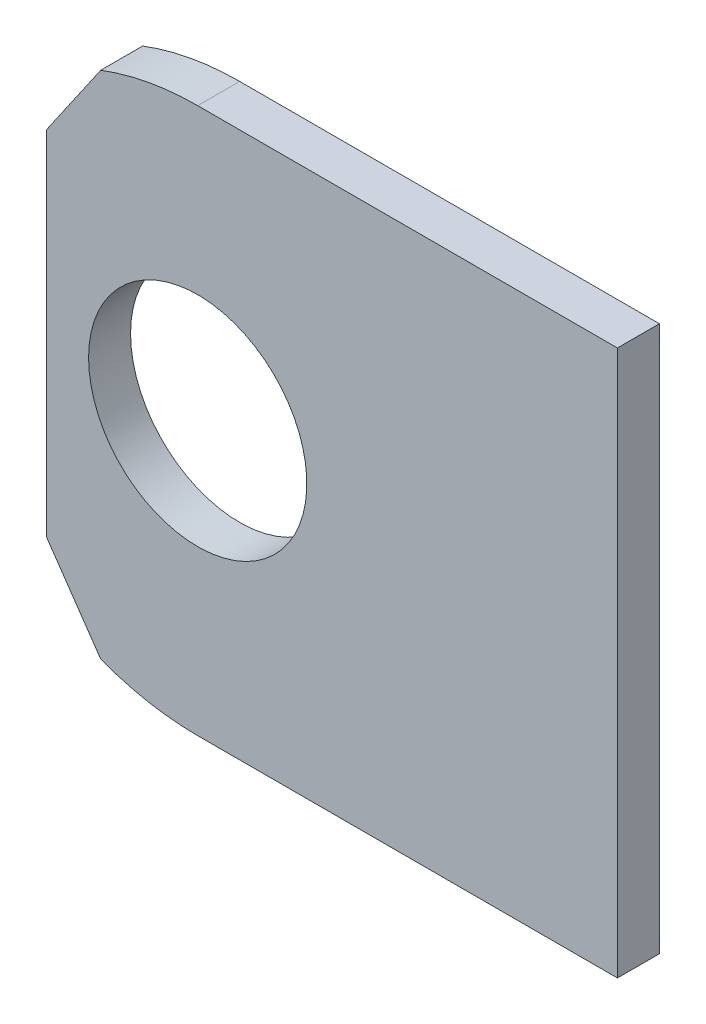
ISO-10303-21;
HEADER;
FILE_DESCRIPTION(('STEP AP214'),'2;1');
FILE_NAME('part.step','',(''),(''),'','','');
FILE_SCHEMA(('AUTOMOTIVE_DESIGN { 1 0 10303 214 1 1 1 1 }'));
ENDSEC;
DATA;
#1=APPLICATION_CONTEXT('core data for automotive mechanical design processes');
#2=APPLICATION_PROTOCOL_DEFINITION('international standard','automotive_design',2000,#1);
#3=PRODUCT_CONTEXT('',#1,'mechanical');
#4=PRODUCT('Part','Part','',(#3));
#5=PRODUCT_RELATED_PRODUCT_CATEGORY('part','',(#4));
#6=PRODUCT_DEFINITION_FORMATION('','',#4);
#7=PRODUCT_DEFINITION_CONTEXT('part definition',#1,'design');
#8=PRODUCT_DEFINITION('design','',#6,#7);
#9=PRODUCT_DEFINITION_SHAPE('','',#8);
#10=(LENGTH_UNIT() NAMED_UNIT(*) SI_UNIT(.MILLI.,.METRE.));
#11=(NAMED_UNIT(*) PLANE_ANGLE_UNIT() SI_UNIT($,.RADIAN.));
#12=(NAMED_UNIT(*) SI_UNIT($,.STERADIAN.) SOLID_ANGLE_UNIT());
#13=UNCERTAINTY_MEASURE_WITH_UNIT(LENGTH_MEASURE(1.E-05),#10,'distance_accuracy_value','');
#14=(GEOMETRIC_REPRESENTATION_CONTEXT(3) GLOBAL_UNCERTAINTY_ASSIGNED_CONTEXT((#13)) GLOBAL_UNIT_ASSIGNED_CONTEXT((#10,
#11,#12)) REPRESENTATION_CONTEXT('',''));
#15=CARTESIAN_POINT('',(0.,0.,0.));
#16=DIRECTION('',(0.,0.,1.));
#17=DIRECTION('',(1.,0.,0.));
#18=AXIS2_PLACEMENT_3D('',#15,#16,#17);
#19=CARTESIAN_POINT('',(0.,0.,0.));
#20=DIRECTION('',(0.,0.,1.));
#21=DIRECTION('',(1.,0.,0.));
#22=AXIS2_PLACEMENT_3D('',#19,#20,#21);
#23=PLANE('',#22);
#24=CARTESIAN_POINT('',(0.,0.,0.));
#25=DIRECTION('',(0.,0.,-1.));
#26=DIRECTION('',(-1.,0.,0.));
#27=AXIS2_PLACEMENT_3D('',#24,#25,#26);
#28=CIRCLE('',#27,2.6);
#29=CARTESIAN_POINT('',(-2.6,0.,0.));
#30=VERTEX_POINT('',#29);
#31=EDGE_CURVE('E96',#30,#30,#28,.F.);
#32=ORIENTED_EDGE('',*,*,#31,.T.);
#33=EDGE_LOOP('',(#32));
#34=FACE_BOUND('',#33,.T.);
#35=DIRECTION('',(1.,0.,0.));
#36=VECTOR('',#35,1.);
#37=CARTESIAN_POINT('',(0.,6.5,0.));
#38=LINE('',#37,#36);
#39=CARTESIAN_POINT('',(10.,6.5,0.));
#40=VERTEX_POINT('',#39);
#41=CARTESIAN_POINT('',(0.,6.5,0.));
#42=VERTEX_POINT('',#41);
#43=EDGE_CURVE('E83',#40,#42,#38,.F.);
#44=ORIENTED_EDGE('',*,*,#43,.F.);
#45=DIRECTION('',(0.,1.,0.));
#46=VECTOR('',#45,1.);
#47=CARTESIAN_POINT('',(10.,6.5,0.));
#48=LINE('',#47,#46);
#49=CARTESIAN_POINT('',(10.,-6.5,0.));
#50=VERTEX_POINT('',#49);
#51=EDGE_CURVE('E100',#50,#40,#48,.T.);
#52=ORIENTED_EDGE('',*,*,#51,.F.);
#53=DIRECTION('',(1.,0.,0.));
#54=VECTOR('',#53,1.);
#55=CARTESIAN_POINT('',(10.,-6.5,0.));
#56=LINE('',#55,#54);
#57=CARTESIAN_POINT('',(0.,-6.5,0.));
#58=VERTEX_POINT('',#57);
#59=EDGE_CURVE('E111',#58,#50,#56,.T.);
#60=ORIENTED_EDGE('',*,*,#59,.F.);
#61=CARTESIAN_POINT('',(0.,0.,0.));
#62=DIRECTION('',(0.,0.,1.));
#63=DIRECTION('',(1.,0.,0.));
#64=AXIS2_PLACEMENT_3D('',#61,#62,#63);
#65=CIRCLE('',#64,6.5);
#66=CARTESIAN_POINT('',(-2.31111111111165,-6.07525846627913,0.));
#67=VERTEX_POINT('',#66);
#68=EDGE_CURVE('E120',#67,#58,#65,.T.);
#69=ORIENTED_EDGE('',*,*,#68,.F.);
#70=DIRECTION('',(0.567646212197499,-0.823272602348598,0.));
#71=VECTOR('',#70,1.);
#72=CARTESIAN_POINT('',(-2.955555555556,-5.140603317621,0.));
#73=LINE('',#72,#71);
#74=CARTESIAN_POINT('',(-3.60000000000005,-4.20594816896305,0.));
#75=VERTEX_POINT('',#74);
#76=EDGE_CURVE('E117',#75,#67,#73,.T.);
#77=ORIENTED_EDGE('',*,*,#76,.F.);
#78=DIRECTION('',(0.,1.,0.));
#79=VECTOR('',#78,1.);
#80=CARTESIAN_POINT('',(-3.6,-6.5,0.));
#81=LINE('',#80,#79);
#82=CARTESIAN_POINT('',(-3.60000000000003,4.20594816896304,0.));
#83=VERTEX_POINT('',#82);
#84=EDGE_CURVE('E124',#75,#83,#81,.T.);
#85=ORIENTED_EDGE('',*,*,#84,.T.);
#86=DIRECTION('',(-0.567646212197499,-0.823272602348598,0.));
#87=VECTOR('',#86,1.);
#88=CARTESIAN_POINT('',(-2.955555555556,5.140603317621,0.));
#89=LINE('',#88,#87);
#90=CARTESIAN_POINT('',(-2.31111111111174,6.07525846627921,0.));
#91=VERTEX_POINT('',#90);
#92=EDGE_CURVE('E85',#91,#83,#89,.T.);
#93=ORIENTED_EDGE('',*,*,#92,.F.);
#94=CARTESIAN_POINT('',(0.,0.,0.));
#95=DIRECTION('',(0.,0.,1.));
#96=DIRECTION('',(1.,0.,0.));
#97=AXIS2_PLACEMENT_3D('',#94,#95,#96);
#98=CIRCLE('',#97,6.5);
#99=EDGE_CURVE('E20',#42,#91,#98,.T.);
#100=ORIENTED_EDGE('',*,*,#99,.F.);
#101=EDGE_LOOP('',(#44,#52,#60,#69,#77,#85,#93,#100));
#102=FACE_BOUND('',#101,.T.);
#103=ADVANCED_FACE('F17',(#34,#102),#23,.F.);
#104=CARTESIAN_POINT('',(0.,0.,0.));
#105=DIRECTION('',(0.,0.,1.));
#106=DIRECTION('',(1.,0.,0.));
#107=AXIS2_PLACEMENT_3D('',#104,#105,#106);
#108=CYLINDRICAL_SURFACE('',#107,6.5);
#109=ORIENTED_EDGE('',*,*,#99,.T.);
#110=DIRECTION('',(0.,0.,1.));
#111=VECTOR('',#110,1.);
#112=CARTESIAN_POINT('',(-2.31111111111163,6.07525846627937,0.5));
#113=LINE('',#112,#111);
#114=CARTESIAN_POINT('',(-2.31111111111174,6.07525846627921,1.));
#115=VERTEX_POINT('',#114);
#116=EDGE_CURVE('E88',#115,#91,#113,.F.);
#117=ORIENTED_EDGE('',*,*,#116,.F.);
#118=CARTESIAN_POINT('',(0.,0.,1.));
#119=DIRECTION('',(0.,0.,1.));
#120=DIRECTION('',(1.,0.,0.));
#121=AXIS2_PLACEMENT_3D('',#118,#119,#120);
#122=CIRCLE('',#121,6.5);
#123=CARTESIAN_POINT('',(0.,6.5,1.));
#124=VERTEX_POINT('',#123);
#125=EDGE_CURVE('E93',#124,#115,#122,.T.);
#126=ORIENTED_EDGE('',*,*,#125,.F.);
#127=DIRECTION('',(0.,0.,1.));
#128=VECTOR('',#127,1.);
#129=CARTESIAN_POINT('',(0.,6.5,0.));
#130=LINE('',#129,#128);
#131=EDGE_CURVE('E90',#42,#124,#130,.T.);
#132=ORIENTED_EDGE('',*,*,#131,.F.);
#133=EDGE_LOOP('',(#109,#117,#126,#132));
#134=FACE_BOUND('',#133,.T.);
#135=ADVANCED_FACE('F91',(#134),#108,.T.);
#136=CARTESIAN_POINT('',(-2.955555555556,5.140603317621,0.5));
#137=DIRECTION('',(-0.823272602348598,0.567646212197499,0.));
#138=DIRECTION('',(-0.567646212197499,-0.823272602348598,0.));
#139=AXIS2_PLACEMENT_3D('',#136,#137,#138);
#140=PLANE('',#139);
#141=DIRECTION('',(0.,0.,-1.));
#142=VECTOR('',#141,1.);
#143=CARTESIAN_POINT('',(-3.6,4.20594816896303,1.));
#144=LINE('',#143,#142);
#145=CARTESIAN_POINT('',(-3.60000000000004,4.20594816896304,1.));
#146=VERTEX_POINT('',#145);
#147=EDGE_CURVE('E126',#83,#146,#144,.F.);
#148=ORIENTED_EDGE('',*,*,#147,.T.);
#149=DIRECTION('',(-0.567646212197488,-0.823272602348605,0.));
#150=VECTOR('',#149,1.);
#151=CARTESIAN_POINT('',(-2.31111111111163,6.07525846627937,1.));
#152=LINE('',#151,#150);
#153=EDGE_CURVE('E138',#115,#146,#152,.T.);
#154=ORIENTED_EDGE('',*,*,#153,.F.);
#155=ORIENTED_EDGE('',*,*,#116,.T.);
#156=ORIENTED_EDGE('',*,*,#92,.T.);
#157=EDGE_LOOP('',(#148,#154,#155,#156));
#158=FACE_BOUND('',#157,.T.);
#159=ADVANCED_FACE('F163',(#158),#140,.T.);
#160=CARTESIAN_POINT('',(-3.6,-6.5,1.));
#161=DIRECTION('',(1.,0.,0.));
#162=DIRECTION('',(0.,0.,-1.));
#163=AXIS2_PLACEMENT_3D('',#160,#161,#162);
#164=PLANE('',#163);
#165=DIRECTION('',(0.,0.,1.));
#166=VECTOR('',#165,1.);
#167=CARTESIAN_POINT('',(-3.60000000000008,-4.20594816896306,0.5));
#168=LINE('',#167,#166);
#169=CARTESIAN_POINT('',(-3.60000000000006,-4.20594816896304,1.));
#170=VERTEX_POINT('',#169);
#171=EDGE_CURVE('E121',#170,#75,#168,.F.);
#172=ORIENTED_EDGE('',*,*,#171,.F.);
#173=DIRECTION('',(0.,1.,0.));
#174=VECTOR('',#173,1.);
#175=CARTESIAN_POINT('',(-3.60000000000005,0.,1.));
#176=LINE('',#175,#174);
#177=EDGE_CURVE('E153',#146,#170,#176,.F.);
#178=ORIENTED_EDGE('',*,*,#177,.F.);
#179=ORIENTED_EDGE('',*,*,#147,.F.);
#180=ORIENTED_EDGE('',*,*,#84,.F.);
#181=EDGE_LOOP('',(#172,#178,#179,#180));
#182=FACE_BOUND('',#181,.T.);
#183=ADVANCED_FACE('F166',(#182),#164,.F.);
#184=CARTESIAN_POINT('',(-2.955555555556,-5.140603317621,0.5));
#185=DIRECTION('',(-0.823272602348598,-0.567646212197499,0.));
#186=DIRECTION('',(0.567646212197499,-0.823272602348598,0.));
#187=AXIS2_PLACEMENT_3D('',#184,#185,#186);
#188=PLANE('',#187);
#189=ORIENTED_EDGE('',*,*,#171,.T.);
#190=ORIENTED_EDGE('',*,*,#76,.T.);
#191=DIRECTION('',(0.,0.,1.));
#192=VECTOR('',#191,1.);
#193=CARTESIAN_POINT('',(-2.31111111111146,-6.0752584662792,0.));
#194=LINE('',#193,#192);
#195=CARTESIAN_POINT('',(-2.31111111111146,-6.0752584662792,1.));
#196=VERTEX_POINT('',#195);
#197=EDGE_CURVE('E114',#196,#67,#194,.F.);
#198=ORIENTED_EDGE('',*,*,#197,.F.);
#199=DIRECTION('',(0.567646212197572,-0.823272602348547,0.));
#200=VECTOR('',#199,1.);
#201=CARTESIAN_POINT('',(-3.60000000000005,-4.20594816896304,1.));
#202=LINE('',#201,#200);
#203=EDGE_CURVE('E136',#170,#196,#202,.T.);
#204=ORIENTED_EDGE('',*,*,#203,.F.);
#205=EDGE_LOOP('',(#189,#190,#198,#204));
#206=FACE_BOUND('',#205,.T.);
#207=ADVANCED_FACE('F235',(#206),#188,.T.);
#208=CARTESIAN_POINT('',(0.,0.,0.));
#209=DIRECTION('',(0.,0.,1.));
#210=DIRECTION('',(1.,0.,0.));
#211=AXIS2_PLACEMENT_3D('',#208,#209,#210);
#212=CYLINDRICAL_SURFACE('',#211,6.5);
#213=CARTESIAN_POINT('',(0.,0.,1.));
#214=DIRECTION('',(0.,0.,1.));
#215=DIRECTION('',(1.,0.,0.));
#216=AXIS2_PLACEMENT_3D('',#213,#214,#215);
#217=CIRCLE('',#216,6.5);
#218=CARTESIAN_POINT('',(0.,-6.5,1.));
#219=VERTEX_POINT('',#218);
#220=EDGE_CURVE('E132',#196,#219,#217,.T.);
#221=ORIENTED_EDGE('',*,*,#220,.F.);
#222=ORIENTED_EDGE('',*,*,#197,.T.);
#223=ORIENTED_EDGE('',*,*,#68,.T.);
#224=DIRECTION('',(0.,0.,-1.));
#225=VECTOR('',#224,1.);
#226=CARTESIAN_POINT('',(0.,-6.5,0.));
#227=LINE('',#226,#225);
#228=EDGE_CURVE('E113',#219,#58,#227,.T.);
#229=ORIENTED_EDGE('',*,*,#228,.F.);
#230=EDGE_LOOP('',(#221,#222,#223,#229));
#231=FACE_BOUND('',#230,.T.);
#232=ADVANCED_FACE('F191',(#231),#212,.T.);
#233=CARTESIAN_POINT('',(10.,-6.5,0.));
#234=DIRECTION('',(0.,-1.,0.));
#235=DIRECTION('',(0.,0.,-1.));
#236=AXIS2_PLACEMENT_3D('',#233,#234,#235);
#237=PLANE('',#236);
#238=DIRECTION('',(1.,0.,0.));
#239=VECTOR('',#238,1.);
#240=CARTESIAN_POINT('',(0.,-6.5,1.));
#241=LINE('',#240,#239);
#242=CARTESIAN_POINT('',(10.,-6.5,1.));
#243=VERTEX_POINT('',#242);
#244=EDGE_CURVE('E135',#219,#243,#241,.T.);
#245=ORIENTED_EDGE('',*,*,#244,.F.);
#246=ORIENTED_EDGE('',*,*,#228,.T.);
#247=ORIENTED_EDGE('',*,*,#59,.T.);
#248=DIRECTION('',(0.,0.,-1.));
#249=VECTOR('',#248,1.);
#250=CARTESIAN_POINT('',(10.,-6.5,0.));
#251=LINE('',#250,#249);
#252=EDGE_CURVE('E108',#243,#50,#251,.T.);
#253=ORIENTED_EDGE('',*,*,#252,.F.);
#254=EDGE_LOOP('',(#245,#246,#247,#253));
#255=FACE_BOUND('',#254,.T.);
#256=ADVANCED_FACE('F189',(#255),#237,.T.);
#257=CARTESIAN_POINT('',(10.,6.5,0.));
#258=DIRECTION('',(1.,0.,0.));
#259=DIRECTION('',(0.,0.,-1.));
#260=AXIS2_PLACEMENT_3D('',#257,#258,#259);
#261=PLANE('',#260);
#262=ORIENTED_EDGE('',*,*,#252,.T.);
#263=ORIENTED_EDGE('',*,*,#51,.T.);
#264=DIRECTION('',(0.,0.,1.));
#265=VECTOR('',#264,1.);
#266=CARTESIAN_POINT('',(10.,6.5,0.));
#267=LINE('',#266,#265);
#268=CARTESIAN_POINT('',(10.,6.5,1.));
#269=VERTEX_POINT('',#268);
#270=EDGE_CURVE('E35',#269,#40,#267,.F.);
#271=ORIENTED_EDGE('',*,*,#270,.F.);
#272=DIRECTION('',(0.,1.,0.));
#273=VECTOR('',#272,1.);
#274=CARTESIAN_POINT('',(10.,0.,1.));
#275=LINE('',#274,#273);
#276=EDGE_CURVE('E181',#243,#269,#275,.T.);
#277=ORIENTED_EDGE('',*,*,#276,.F.);
#278=EDGE_LOOP('',(#262,#263,#271,#277));
#279=FACE_BOUND('',#278,.T.);
#280=ADVANCED_FACE('F199',(#279),#261,.T.);
#281=CARTESIAN_POINT('',(0.,6.5,0.));
#282=DIRECTION('',(0.,1.,0.));
#283=DIRECTION('',(0.,0.,1.));
#284=AXIS2_PLACEMENT_3D('',#281,#282,#283);
#285=PLANE('',#284);
#286=ORIENTED_EDGE('',*,*,#43,.T.);
#287=ORIENTED_EDGE('',*,*,#131,.T.);
#288=DIRECTION('',(1.,0.,0.));
#289=VECTOR('',#288,1.);
#290=CARTESIAN_POINT('',(0.,6.5,1.));
#291=LINE('',#290,#289);
#292=EDGE_CURVE('E26',#269,#124,#291,.F.);
#293=ORIENTED_EDGE('',*,*,#292,.F.);
#294=ORIENTED_EDGE('',*,*,#270,.T.);
#295=EDGE_LOOP('',(#286,#287,#293,#294));
#296=FACE_BOUND('',#295,.T.);
#297=ADVANCED_FACE('F98',(#296),#285,.T.);
#298=CARTESIAN_POINT('',(0.,0.,0.));
#299=DIRECTION('',(0.,0.,-1.));
#300=DIRECTION('',(-1.,0.,0.));
#301=AXIS2_PLACEMENT_3D('',#298,#299,#300);
#302=CYLINDRICAL_SURFACE('',#301,2.6);
#303=ORIENTED_EDGE('',*,*,#31,.F.);
#304=EDGE_LOOP('',(#303));
#305=FACE_BOUND('',#304,.T.);
#306=CARTESIAN_POINT('',(0.,0.,1.));
#307=DIRECTION('',(0.,0.,-1.));
#308=DIRECTION('',(-1.,0.,0.));
#309=AXIS2_PLACEMENT_3D('',#306,#307,#308);
#310=CIRCLE('',#309,2.6);
#311=CARTESIAN_POINT('',(-2.6,0.,1.));
#312=VERTEX_POINT('',#311);
#313=EDGE_CURVE('E11',#312,#312,#310,.T.);
#314=ORIENTED_EDGE('',*,*,#313,.F.);
#315=EDGE_LOOP('',(#314));
#316=FACE_BOUND('',#315,.T.);
#317=ADVANCED_FACE('F207',(#305,#316),#302,.F.);
#318=CARTESIAN_POINT('',(0.,0.,1.));
#319=DIRECTION('',(0.,0.,1.));
#320=DIRECTION('',(1.,0.,0.));
#321=AXIS2_PLACEMENT_3D('',#318,#319,#320);
#322=PLANE('',#321);
#323=ORIENTED_EDGE('',*,*,#313,.T.);
#324=EDGE_LOOP('',(#323));
#325=FACE_BOUND('',#324,.T.);
#326=ORIENTED_EDGE('',*,*,#276,.T.);
#327=ORIENTED_EDGE('',*,*,#292,.T.);
#328=ORIENTED_EDGE('',*,*,#125,.T.);
#329=ORIENTED_EDGE('',*,*,#153,.T.);
#330=ORIENTED_EDGE('',*,*,#177,.T.);
#331=ORIENTED_EDGE('',*,*,#203,.T.);
#332=ORIENTED_EDGE('',*,*,#220,.T.);
#333=ORIENTED_EDGE('',*,*,#244,.T.);
#334=EDGE_LOOP('',(#326,#327,#328,#329,#330,#331,#332,#333));
#335=FACE_BOUND('',#334,.T.);
#336=ADVANCED_FACE('F171',(#325,#335),#322,.T.);
#337=CLOSED_SHELL('',(#103,#135,#159,#183,#207,#232,#256,#280,#297,#317,#336));
#338=MANIFOLD_SOLID_BREP('B1',#337);
#339=ADVANCED_BREP_SHAPE_REPRESENTATION('',(#18,#338),#14);
#340=SHAPE_DEFINITION_REPRESENTATION(#9,#339);
ENDSEC;
END-ISO-10303-21;
